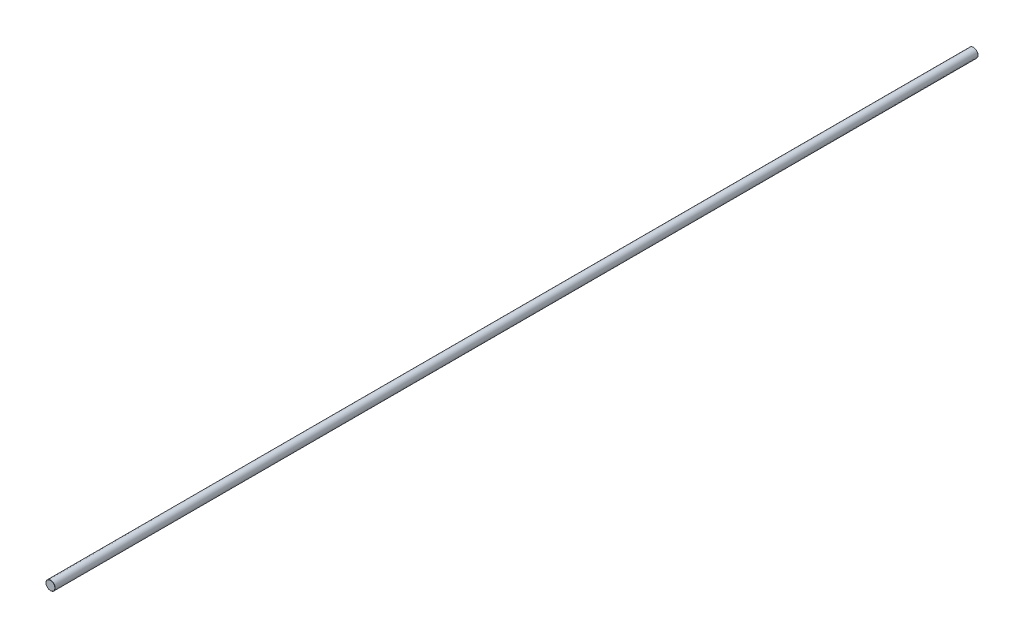
ISO-10303-21;
HEADER;
FILE_DESCRIPTION(('STEP AP214'),'2;1');
FILE_NAME('part.step','',(''),(''),'','','');
FILE_SCHEMA(('AUTOMOTIVE_DESIGN { 1 0 10303 214 1 1 1 1 }'));
ENDSEC;
DATA;
#1=APPLICATION_CONTEXT('core data for automotive mechanical design processes');
#2=APPLICATION_PROTOCOL_DEFINITION('international standard','automotive_design',2000,#1);
#3=PRODUCT_CONTEXT('',#1,'mechanical');
#4=PRODUCT('Part','Part','',(#3));
#5=PRODUCT_RELATED_PRODUCT_CATEGORY('part','',(#4));
#6=PRODUCT_DEFINITION_FORMATION('','',#4);
#7=PRODUCT_DEFINITION_CONTEXT('part definition',#1,'design');
#8=PRODUCT_DEFINITION('design','',#6,#7);
#9=PRODUCT_DEFINITION_SHAPE('','',#8);
#10=(LENGTH_UNIT() NAMED_UNIT(*) SI_UNIT(.MILLI.,.METRE.));
#11=(NAMED_UNIT(*) PLANE_ANGLE_UNIT() SI_UNIT($,.RADIAN.));
#12=(NAMED_UNIT(*) SI_UNIT($,.STERADIAN.) SOLID_ANGLE_UNIT());
#13=UNCERTAINTY_MEASURE_WITH_UNIT(LENGTH_MEASURE(1.E-05),#10,'distance_accuracy_value','');
#14=(GEOMETRIC_REPRESENTATION_CONTEXT(3) GLOBAL_UNCERTAINTY_ASSIGNED_CONTEXT((#13)) GLOBAL_UNIT_ASSIGNED_CONTEXT((#10,
#11,#12)) REPRESENTATION_CONTEXT('',''));
#15=CARTESIAN_POINT('',(0.,0.,0.));
#16=DIRECTION('',(0.,0.,1.));
#17=DIRECTION('',(1.,0.,0.));
#18=AXIS2_PLACEMENT_3D('',#15,#16,#17);
#19=CARTESIAN_POINT('',(0.,0.,500.));
#20=DIRECTION('',(0.,0.,-1.));
#21=DIRECTION('',(-1.,0.,0.));
#22=AXIS2_PLACEMENT_3D('',#19,#20,#21);
#23=CYLINDRICAL_SURFACE('',#22,5.);
#24=CARTESIAN_POINT('',(0.,0.,-499.8));
#25=DIRECTION('',(0.,0.,1.));
#26=DIRECTION('',(1.,0.,0.));
#27=AXIS2_PLACEMENT_3D('',#24,#25,#26);
#28=CIRCLE('',#27,5.);
#29=CARTESIAN_POINT('',(5.,0.,-499.8));
#30=VERTEX_POINT('',#29);
#31=EDGE_CURVE('E46',#30,#30,#28,.T.);
#32=ORIENTED_EDGE('',*,*,#31,.T.);
#33=EDGE_LOOP('',(#32));
#34=FACE_BOUND('',#33,.T.);
#35=CARTESIAN_POINT('',(0.,0.,499.8));
#36=DIRECTION('',(0.,0.,1.));
#37=DIRECTION('',(1.,0.,0.));
#38=AXIS2_PLACEMENT_3D('',#35,#36,#37);
#39=CIRCLE('',#38,5.);
#40=CARTESIAN_POINT('',(5.,0.,499.8));
#41=VERTEX_POINT('',#40);
#42=EDGE_CURVE('E50',#41,#41,#39,.F.);
#43=ORIENTED_EDGE('',*,*,#42,.T.);
#44=EDGE_LOOP('',(#43));
#45=FACE_BOUND('',#44,.T.);
#46=ADVANCED_FACE('F35',(#34,#45),#23,.T.);
#47=CARTESIAN_POINT('',(0.,0.,500.));
#48=DIRECTION('',(0.,0.,1.));
#49=DIRECTION('',(1.,0.,0.));
#50=AXIS2_PLACEMENT_3D('',#47,#48,#49);
#51=PLANE('',#50);
#52=CARTESIAN_POINT('',(0.,0.,500.));
#53=DIRECTION('',(0.,0.,1.));
#54=DIRECTION('',(1.,0.,0.));
#55=AXIS2_PLACEMENT_3D('',#52,#53,#54);
#56=CIRCLE('',#55,4.80000000000014);
#57=CARTESIAN_POINT('',(4.80000000000014,0.,500.));
#58=VERTEX_POINT('',#57);
#59=EDGE_CURVE('E10',#58,#58,#56,.T.);
#60=ORIENTED_EDGE('',*,*,#59,.T.);
#61=EDGE_LOOP('',(#60));
#62=FACE_BOUND('',#61,.T.);
#63=ADVANCED_FACE('F66',(#62),#51,.T.);
#64=CARTESIAN_POINT('',(0.,0.,-500.));
#65=DIRECTION('',(0.,0.,1.));
#66=DIRECTION('',(1.,0.,0.));
#67=AXIS2_PLACEMENT_3D('',#64,#65,#66);
#68=PLANE('',#67);
#69=CARTESIAN_POINT('',(0.,0.,-500.));
#70=DIRECTION('',(0.,0.,1.));
#71=DIRECTION('',(1.,0.,0.));
#72=AXIS2_PLACEMENT_3D('',#69,#70,#71);
#73=CIRCLE('',#72,4.79999999999992);
#74=CARTESIAN_POINT('',(4.79999999999992,0.,-500.));
#75=VERTEX_POINT('',#74);
#76=EDGE_CURVE('E42',#75,#75,#73,.F.);
#77=ORIENTED_EDGE('',*,*,#76,.T.);
#78=EDGE_LOOP('',(#77));
#79=FACE_BOUND('',#78,.T.);
#80=ADVANCED_FACE('F63',(#79),#68,.F.);
#81=CARTESIAN_POINT('',(0.,0.,-499.8));
#82=DIRECTION('',(0.,0.,1.));
#83=DIRECTION('',(1.,0.,0.));
#84=AXIS2_PLACEMENT_3D('',#81,#82,#83);
#85=CONICAL_SURFACE('',#84,5.,0.785398163397438);
#86=ORIENTED_EDGE('',*,*,#76,.F.);
#87=EDGE_LOOP('',(#86));
#88=FACE_BOUND('',#87,.T.);
#89=ORIENTED_EDGE('',*,*,#31,.F.);
#90=EDGE_LOOP('',(#89));
#91=FACE_BOUND('',#90,.T.);
#92=ADVANCED_FACE('F59',(#88,#91),#85,.T.);
#93=CARTESIAN_POINT('',(0.,0.,500.));
#94=DIRECTION('',(0.,0.,-1.));
#95=DIRECTION('',(-1.,0.,0.));
#96=AXIS2_PLACEMENT_3D('',#93,#94,#95);
#97=CONICAL_SURFACE('',#96,4.80000000000014,0.785398163397438);
#98=ORIENTED_EDGE('',*,*,#42,.F.);
#99=EDGE_LOOP('',(#98));
#100=FACE_BOUND('',#99,.T.);
#101=ORIENTED_EDGE('',*,*,#59,.F.);
#102=EDGE_LOOP('',(#101));
#103=FACE_BOUND('',#102,.T.);
#104=ADVANCED_FACE('F37',(#100,#103),#97,.T.);
#105=CLOSED_SHELL('',(#46,#63,#80,#92,#104));
#106=MANIFOLD_SOLID_BREP('B2',#105);
#107=ADVANCED_BREP_SHAPE_REPRESENTATION('',(#18,#106),#14);
#108=SHAPE_DEFINITION_REPRESENTATION(#9,#107);
ENDSEC;
END-ISO-10303-21;
